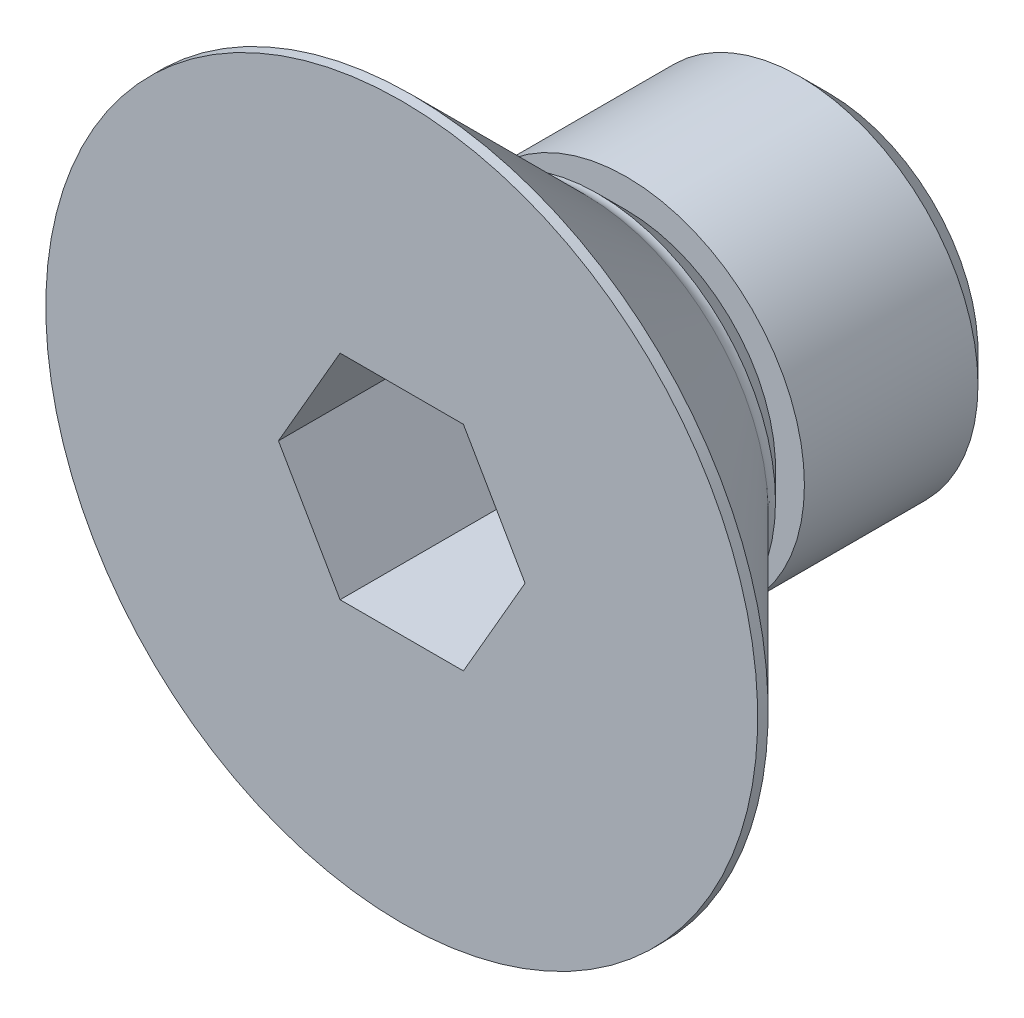
ISO-10303-21;
HEADER;
FILE_DESCRIPTION(('STEP AP214'),'2;1');
FILE_NAME('part.step','',(''),(''),'','','');
FILE_SCHEMA(('AUTOMOTIVE_DESIGN { 1 0 10303 214 1 1 1 1 }'));
ENDSEC;
DATA;
#1=APPLICATION_CONTEXT('core data for automotive mechanical design processes');
#2=APPLICATION_PROTOCOL_DEFINITION('international standard','automotive_design',2000,#1);
#3=PRODUCT_CONTEXT('',#1,'mechanical');
#4=PRODUCT('Part','Part','',(#3));
#5=PRODUCT_RELATED_PRODUCT_CATEGORY('part','',(#4));
#6=PRODUCT_DEFINITION_FORMATION('','',#4);
#7=PRODUCT_DEFINITION_CONTEXT('part definition',#1,'design');
#8=PRODUCT_DEFINITION('design','',#6,#7);
#9=PRODUCT_DEFINITION_SHAPE('','',#8);
#10=(LENGTH_UNIT() NAMED_UNIT(*) SI_UNIT(.MILLI.,.METRE.));
#11=(NAMED_UNIT(*) PLANE_ANGLE_UNIT() SI_UNIT($,.RADIAN.));
#12=(NAMED_UNIT(*) SI_UNIT($,.STERADIAN.) SOLID_ANGLE_UNIT());
#13=UNCERTAINTY_MEASURE_WITH_UNIT(LENGTH_MEASURE(1.E-05),#10,'distance_accuracy_value','');
#14=(GEOMETRIC_REPRESENTATION_CONTEXT(3) GLOBAL_UNCERTAINTY_ASSIGNED_CONTEXT((#13)) GLOBAL_UNIT_ASSIGNED_CONTEXT((#10,
#11,#12)) REPRESENTATION_CONTEXT('',''));
#15=CARTESIAN_POINT('',(0.,0.,0.));
#16=DIRECTION('',(0.,0.,1.));
#17=DIRECTION('',(1.,0.,0.));
#18=AXIS2_PLACEMENT_3D('',#15,#16,#17);
#19=CARTESIAN_POINT('',(0.,2.0940625,-12.));
#20=DIRECTION('',(0.,0.,-1.));
#21=DIRECTION('',(0.,1.,0.));
#22=AXIS2_PLACEMENT_3D('',#19,#20,#21);
#23=PLANE('',#22);
#24=CARTESIAN_POINT('',(0.,0.,-12.));
#25=DIRECTION('',(0.,0.,-1.));
#26=DIRECTION('',(0.,1.,0.));
#27=AXIS2_PLACEMENT_3D('',#24,#25,#26);
#28=CIRCLE('',#27,4.188125);
#29=CARTESIAN_POINT('',(0.,4.188125,-12.));
#30=VERTEX_POINT('',#29);
#31=EDGE_CURVE('E11',#30,#30,#28,.T.);
#32=ORIENTED_EDGE('',*,*,#31,.T.);
#33=EDGE_LOOP('',(#32));
#34=FACE_BOUND('',#33,.T.);
#35=ADVANCED_FACE('F17',(#34),#23,.T.);
#36=CARTESIAN_POINT('',(0.,0.,-11.5940625));
#37=DIRECTION('',(0.,0.,1.));
#38=DIRECTION('',(0.,1.,0.));
#39=AXIS2_PLACEMENT_3D('',#36,#37,#38);
#40=CONICAL_SURFACE('',#39,4.5940625,0.785398163397448);
#41=CARTESIAN_POINT('',(0.,0.,-11.188125));
#42=DIRECTION('',(0.,0.,-1.));
#43=DIRECTION('',(0.,1.,0.));
#44=AXIS2_PLACEMENT_3D('',#41,#42,#43);
#45=CIRCLE('',#44,5.);
#46=CARTESIAN_POINT('',(0.,5.,-11.188125));
#47=VERTEX_POINT('',#46);
#48=EDGE_CURVE('E29',#47,#47,#45,.T.);
#49=ORIENTED_EDGE('',*,*,#48,.T.);
#50=EDGE_LOOP('',(#49));
#51=FACE_BOUND('',#50,.T.);
#52=ORIENTED_EDGE('',*,*,#31,.F.);
#53=EDGE_LOOP('',(#52));
#54=FACE_BOUND('',#53,.T.);
#55=ADVANCED_FACE('F210',(#51,#54),#40,.T.);
#56=CARTESIAN_POINT('',(0.,0.,-8.5940625));
#57=DIRECTION('',(0.,0.,1.));
#58=DIRECTION('',(0.,1.,0.));
#59=AXIS2_PLACEMENT_3D('',#56,#57,#58);
#60=CYLINDRICAL_SURFACE('',#59,5.);
#61=ORIENTED_EDGE('',*,*,#48,.F.);
#62=EDGE_LOOP('',(#61));
#63=FACE_BOUND('',#62,.T.);
#64=CARTESIAN_POINT('',(0.,0.,-6.311875));
#65=DIRECTION('',(0.,0.,-1.));
#66=DIRECTION('',(0.,1.,0.));
#67=AXIS2_PLACEMENT_3D('',#64,#65,#66);
#68=CIRCLE('',#67,5.);
#69=CARTESIAN_POINT('',(0.,-5.,-6.311875));
#70=VERTEX_POINT('',#69);
#71=EDGE_CURVE('E131',#70,#70,#68,.T.);
#72=ORIENTED_EDGE('',*,*,#71,.T.);
#73=EDGE_LOOP('',(#72));
#74=FACE_BOUND('',#73,.T.);
#75=ADVANCED_FACE('F215',(#63,#74),#60,.T.);
#76=CARTESIAN_POINT('',(0.,0.,-5.5));
#77=DIRECTION('',(0.,0.,-1.));
#78=DIRECTION('',(-1.,0.,0.));
#79=AXIS2_PLACEMENT_3D('',#76,#77,#78);
#80=TOROIDAL_SURFACE('',#79,5.5,0.5);
#81=CARTESIAN_POINT('',(0.,0.,-5.14644660940673));
#82=DIRECTION('',(0.,0.,-1.));
#83=DIRECTION('',(0.,1.,0.));
#84=AXIS2_PLACEMENT_3D('',#81,#82,#83);
#85=CIRCLE('',#84,5.14644660940673);
#86=CARTESIAN_POINT('',(0.,5.14644660940673,-5.14644660940673));
#87=VERTEX_POINT('',#86);
#88=EDGE_CURVE('E157',#87,#87,#85,.T.);
#89=ORIENTED_EDGE('',*,*,#88,.T.);
#90=EDGE_LOOP('',(#89));
#91=FACE_BOUND('',#90,.T.);
#92=CARTESIAN_POINT('',(0.,0.,-5.5));
#93=DIRECTION('',(0.,0.,-1.));
#94=DIRECTION('',(0.,1.,0.));
#95=AXIS2_PLACEMENT_3D('',#92,#93,#94);
#96=CIRCLE('',#95,5.);
#97=CARTESIAN_POINT('',(0.,5.,-5.5));
#98=VERTEX_POINT('',#97);
#99=EDGE_CURVE('E154',#98,#98,#96,.T.);
#100=ORIENTED_EDGE('',*,*,#99,.F.);
#101=EDGE_LOOP('',(#100));
#102=FACE_BOUND('',#101,.T.);
#103=ADVANCED_FACE('F207',(#91,#102),#80,.F.);
#104=CARTESIAN_POINT('',(0.,0.,-2.71966991411009));
#105=DIRECTION('',(0.,0.,1.));
#106=DIRECTION('',(0.,1.,0.));
#107=AXIS2_PLACEMENT_3D('',#104,#105,#106);
#108=CONICAL_SURFACE('',#107,7.57322330470336,0.785398163397449);
#109=CARTESIAN_POINT('',(0.,0.,-0.292893218813454));
#110=DIRECTION('',(0.,0.,-1.));
#111=DIRECTION('',(0.,1.,0.));
#112=AXIS2_PLACEMENT_3D('',#109,#110,#111);
#113=CIRCLE('',#112,10.);
#114=CARTESIAN_POINT('',(0.,10.,-0.292893218813454));
#115=VERTEX_POINT('',#114);
#116=EDGE_CURVE('E149',#115,#115,#113,.T.);
#117=ORIENTED_EDGE('',*,*,#116,.T.);
#118=EDGE_LOOP('',(#117));
#119=FACE_BOUND('',#118,.T.);
#120=ORIENTED_EDGE('',*,*,#88,.F.);
#121=EDGE_LOOP('',(#120));
#122=FACE_BOUND('',#121,.T.);
#123=ADVANCED_FACE('F194',(#119,#122),#108,.T.);
#124=CARTESIAN_POINT('',(0.,0.,-0.146446609406727));
#125=DIRECTION('',(0.,0.,1.));
#126=DIRECTION('',(0.,1.,0.));
#127=AXIS2_PLACEMENT_3D('',#124,#125,#126);
#128=CYLINDRICAL_SURFACE('',#127,10.);
#129=CARTESIAN_POINT('',(0.,0.,0.));
#130=DIRECTION('',(0.,0.,-1.));
#131=DIRECTION('',(0.,1.,0.));
#132=AXIS2_PLACEMENT_3D('',#129,#130,#131);
#133=CIRCLE('',#132,10.);
#134=CARTESIAN_POINT('',(0.,10.,0.));
#135=VERTEX_POINT('',#134);
#136=EDGE_CURVE('E147',#135,#135,#133,.T.);
#137=ORIENTED_EDGE('',*,*,#136,.T.);
#138=EDGE_LOOP('',(#137));
#139=FACE_BOUND('',#138,.T.);
#140=ORIENTED_EDGE('',*,*,#116,.F.);
#141=EDGE_LOOP('',(#140));
#142=FACE_BOUND('',#141,.T.);
#143=ADVANCED_FACE('F19',(#139,#142),#128,.T.);
#144=CARTESIAN_POINT('',(0.,5.,0.));
#145=DIRECTION('',(0.,0.,1.));
#146=DIRECTION('',(0.,-1.,0.));
#147=AXIS2_PLACEMENT_3D('',#144,#145,#146);
#148=PLANE('',#147);
#149=ORIENTED_EDGE('',*,*,#136,.F.);
#150=EDGE_LOOP('',(#149));
#151=FACE_BOUND('',#150,.T.);
#152=DIRECTION('',(-0.5,0.866025403784439,0.));
#153=VECTOR('',#152,1.);
#154=CARTESIAN_POINT('',(-3.68060675473055,0.375000699375163,0.));
#155=LINE('',#154,#153);
#156=CARTESIAN_POINT('',(-1.73205,-2.99999860124967,0.));
#157=VERTEX_POINT('',#156);
#158=CARTESIAN_POINT('',(-3.4641,0.,0.));
#159=VERTEX_POINT('',#158);
#160=EDGE_CURVE('E146',#157,#159,#155,.T.);
#161=ORIENTED_EDGE('',*,*,#160,.T.);
#162=DIRECTION('',(0.5,0.866025403784439,0.));
#163=VECTOR('',#162,1.);
#164=CARTESIAN_POINT('',(-1.51554324526946,3.37499930062484,0.));
#165=LINE('',#164,#163);
#166=CARTESIAN_POINT('',(-1.73205,2.99999860124967,0.));
#167=VERTEX_POINT('',#166);
#168=EDGE_CURVE('E79',#159,#167,#165,.T.);
#169=ORIENTED_EDGE('',*,*,#168,.T.);
#170=DIRECTION('',(1.,0.,0.));
#171=VECTOR('',#170,1.);
#172=CARTESIAN_POINT('',(0.,2.99999860124967,0.));
#173=LINE('',#172,#171);
#174=CARTESIAN_POINT('',(1.73205,2.99999860124967,0.));
#175=VERTEX_POINT('',#174);
#176=EDGE_CURVE('E107',#167,#175,#173,.T.);
#177=ORIENTED_EDGE('',*,*,#176,.T.);
#178=DIRECTION('',(0.5,-0.866025403784439,0.));
#179=VECTOR('',#178,1.);
#180=CARTESIAN_POINT('',(1.51554324526945,3.37499930062484,0.));
#181=LINE('',#180,#179);
#182=CARTESIAN_POINT('',(3.4641,0.,0.));
#183=VERTEX_POINT('',#182);
#184=EDGE_CURVE('E150',#175,#183,#181,.T.);
#185=ORIENTED_EDGE('',*,*,#184,.T.);
#186=DIRECTION('',(-0.5,-0.866025403784439,0.));
#187=VECTOR('',#186,1.);
#188=CARTESIAN_POINT('',(3.68060675473055,0.375000699375163,0.));
#189=LINE('',#188,#187);
#190=CARTESIAN_POINT('',(1.73205,-2.99999860124967,0.));
#191=VERTEX_POINT('',#190);
#192=EDGE_CURVE('E141',#183,#191,#189,.T.);
#193=ORIENTED_EDGE('',*,*,#192,.T.);
#194=DIRECTION('',(-1.,0.,0.));
#195=VECTOR('',#194,1.);
#196=CARTESIAN_POINT('',(0.,-2.99999860124967,0.));
#197=LINE('',#196,#195);
#198=EDGE_CURVE('E171',#191,#157,#197,.T.);
#199=ORIENTED_EDGE('',*,*,#198,.T.);
#200=EDGE_LOOP('',(#161,#169,#177,#185,#193,#199));
#201=FACE_BOUND('',#200,.T.);
#202=ADVANCED_FACE('F198',(#151,#201),#148,.T.);
#203=CARTESIAN_POINT('',(-2.598075,1.49999930062484,1.));
#204=DIRECTION('',(-0.866025403784439,0.5,0.));
#205=DIRECTION('',(0.5,0.866025403784439,0.));
#206=AXIS2_PLACEMENT_3D('',#203,#204,#205);
#207=PLANE('',#206);
#208=ORIENTED_EDGE('',*,*,#168,.F.);
#209=DIRECTION('',(0.,0.,-1.));
#210=VECTOR('',#209,1.);
#211=CARTESIAN_POINT('',(-3.4641,0.,1.));
#212=LINE('',#211,#210);
#213=CARTESIAN_POINT('',(-3.4641,0.,-4.4));
#214=VERTEX_POINT('',#213);
#215=EDGE_CURVE('E111',#159,#214,#212,.T.);
#216=ORIENTED_EDGE('',*,*,#215,.T.);
#217=CARTESIAN_POINT('',(-3.4641,0.,-4.4));
#218=CARTESIAN_POINT('',(-2.598075,1.49999930062483,-4.89999976687495));
#219=CARTESIAN_POINT('',(-1.73205,2.99999860124967,-4.4));
#220=(BOUNDED_CURVE() B_SPLINE_CURVE(2,(#217,#218,#219),.UNSPECIFIED.,.F.,
.F.) B_SPLINE_CURVE_WITH_KNOTS((3,3),(0.,3.50530677988333),
.UNSPECIFIED.) CURVE() GEOMETRIC_REPRESENTATION_ITEM() RATIONAL_B_SPLINE_CURVE((1.,
1.15470053837925,1.)) REPRESENTATION_ITEM(''));
#221=CARTESIAN_POINT('',(-1.73205,2.99999860124967,-4.4));
#222=VERTEX_POINT('',#221);
#223=EDGE_CURVE('E109',#214,#222,#220,.T.);
#224=ORIENTED_EDGE('',*,*,#223,.T.);
#225=DIRECTION('',(0.,0.,-1.));
#226=VECTOR('',#225,1.);
#227=CARTESIAN_POINT('',(-1.73205,2.99999860124967,1.));
#228=LINE('',#227,#226);
#229=EDGE_CURVE('E100',#167,#222,#228,.T.);
#230=ORIENTED_EDGE('',*,*,#229,.F.);
#231=EDGE_LOOP('',(#208,#216,#224,#230));
#232=FACE_BOUND('',#231,.T.);
#233=ADVANCED_FACE('F110',(#232),#207,.F.);
#234=CARTESIAN_POINT('',(0.,2.99999860124967,1.));
#235=DIRECTION('',(0.,1.,0.));
#236=DIRECTION('',(1.,0.,0.));
#237=AXIS2_PLACEMENT_3D('',#234,#235,#236);
#238=PLANE('',#237);
#239=ORIENTED_EDGE('',*,*,#176,.F.);
#240=ORIENTED_EDGE('',*,*,#229,.T.);
#241=CARTESIAN_POINT('',(-1.73205,2.99999860124967,-4.4));
#242=CARTESIAN_POINT('',(0.,2.99999860124967,-4.89999976687495));
#243=CARTESIAN_POINT('',(1.73205,2.99999860124967,-4.4));
#244=(BOUNDED_CURVE() B_SPLINE_CURVE(2,(#241,#242,#243),.UNSPECIFIED.,.F.,
.F.) B_SPLINE_CURVE_WITH_KNOTS((3,3),(0.,3.50530677988333),
.UNSPECIFIED.) CURVE() GEOMETRIC_REPRESENTATION_ITEM() RATIONAL_B_SPLINE_CURVE((1.,
1.15470053837925,1.)) REPRESENTATION_ITEM(''));
#245=CARTESIAN_POINT('',(1.73205,2.99999860124967,-4.4));
#246=VERTEX_POINT('',#245);
#247=EDGE_CURVE('E105',#222,#246,#244,.T.);
#248=ORIENTED_EDGE('',*,*,#247,.T.);
#249=DIRECTION('',(0.,0.,-1.));
#250=VECTOR('',#249,1.);
#251=CARTESIAN_POINT('',(1.73205,2.99999860124967,1.));
#252=LINE('',#251,#250);
#253=EDGE_CURVE('E153',#175,#246,#252,.T.);
#254=ORIENTED_EDGE('',*,*,#253,.F.);
#255=EDGE_LOOP('',(#239,#240,#248,#254));
#256=FACE_BOUND('',#255,.T.);
#257=ADVANCED_FACE('F102',(#256),#238,.F.);
#258=CARTESIAN_POINT('',(-2.598075,-1.49999930062484,1.));
#259=DIRECTION('',(-0.866025403784439,-0.5,0.));
#260=DIRECTION('',(-0.5,0.866025403784439,0.));
#261=AXIS2_PLACEMENT_3D('',#258,#259,#260);
#262=PLANE('',#261);
#263=ORIENTED_EDGE('',*,*,#160,.F.);
#264=DIRECTION('',(0.,0.,-1.));
#265=VECTOR('',#264,1.);
#266=CARTESIAN_POINT('',(-1.73205,-2.99999860124967,1.));
#267=LINE('',#266,#265);
#268=CARTESIAN_POINT('',(-1.73205,-2.99999860124967,-4.4));
#269=VERTEX_POINT('',#268);
#270=EDGE_CURVE('E117',#157,#269,#267,.T.);
#271=ORIENTED_EDGE('',*,*,#270,.T.);
#272=CARTESIAN_POINT('',(-1.73205,-2.99999860124967,-4.4));
#273=CARTESIAN_POINT('',(-2.598075,-1.49999930062485,-4.89999976687495));
#274=CARTESIAN_POINT('',(-3.4641,0.,-4.4));
#275=(BOUNDED_CURVE() B_SPLINE_CURVE(2,(#272,#273,#274),.UNSPECIFIED.,.F.,
.F.) B_SPLINE_CURVE_WITH_KNOTS((3,3),(0.,3.50530677988333),
.UNSPECIFIED.) CURVE() GEOMETRIC_REPRESENTATION_ITEM() RATIONAL_B_SPLINE_CURVE((1.,
1.15470053837924,1.)) REPRESENTATION_ITEM(''));
#276=EDGE_CURVE('E95',#269,#214,#275,.T.);
#277=ORIENTED_EDGE('',*,*,#276,.T.);
#278=ORIENTED_EDGE('',*,*,#215,.F.);
#279=EDGE_LOOP('',(#263,#271,#277,#278));
#280=FACE_BOUND('',#279,.T.);
#281=ADVANCED_FACE('F222',(#280),#262,.F.);
#282=CARTESIAN_POINT('',(0.,0.,-5.39999953374989));
#283=DIRECTION('',(0.,0.,1.));
#284=DIRECTION('',(0.,1.,0.));
#285=AXIS2_PLACEMENT_3D('',#282,#283,#284);
#286=CONICAL_SURFACE('',#285,1.73205,1.0471975511966);
#287=CARTESIAN_POINT('',(0.,0.,-6.39999906749978));
#288=VERTEX_POINT('',#287);
#289=VERTEX_LOOP('',#288);
#290=FACE_BOUND('',#289,.T.);
#291=CARTESIAN_POINT('',(1.73205,2.99999860124967,-4.4));
#292=CARTESIAN_POINT('',(2.59807500000001,1.49999930062485,-4.89999976687495));
#293=CARTESIAN_POINT('',(3.4641,0.,-4.4));
#294=(BOUNDED_CURVE() B_SPLINE_CURVE(2,(#291,#292,#293),.UNSPECIFIED.,.F.,
.F.) B_SPLINE_CURVE_WITH_KNOTS((3,3),(0.,3.50530677988333),
.UNSPECIFIED.) CURVE() GEOMETRIC_REPRESENTATION_ITEM() RATIONAL_B_SPLINE_CURVE((1.,
1.15470053837924,1.)) REPRESENTATION_ITEM(''));
#295=CARTESIAN_POINT('',(3.4641,0.,-4.4));
#296=VERTEX_POINT('',#295);
#297=EDGE_CURVE('E21',#246,#296,#294,.T.);
#298=ORIENTED_EDGE('',*,*,#297,.F.);
#299=ORIENTED_EDGE('',*,*,#247,.F.);
#300=ORIENTED_EDGE('',*,*,#223,.F.);
#301=ORIENTED_EDGE('',*,*,#276,.F.);
#302=CARTESIAN_POINT('',(1.73205,-2.99999860124967,-4.4));
#303=CARTESIAN_POINT('',(0.,-2.99999860124969,-4.89999976687495));
#304=CARTESIAN_POINT('',(-1.73205,-2.99999860124967,-4.4));
#305=(BOUNDED_CURVE() B_SPLINE_CURVE(2,(#302,#303,#304),.UNSPECIFIED.,.F.,
.F.) B_SPLINE_CURVE_WITH_KNOTS((3,3),(0.,3.50530677988333),
.UNSPECIFIED.) CURVE() GEOMETRIC_REPRESENTATION_ITEM() RATIONAL_B_SPLINE_CURVE((1.,
1.15470053837924,1.)) REPRESENTATION_ITEM(''));
#306=CARTESIAN_POINT('',(1.73205,-2.99999860124967,-4.4));
#307=VERTEX_POINT('',#306);
#308=EDGE_CURVE('E119',#307,#269,#305,.T.);
#309=ORIENTED_EDGE('',*,*,#308,.F.);
#310=CARTESIAN_POINT('',(3.4641,0.,-4.4));
#311=CARTESIAN_POINT('',(2.598075,-1.49999930062484,-4.89999976687495));
#312=CARTESIAN_POINT('',(1.73205,-2.99999860124967,-4.4));
#313=(BOUNDED_CURVE() B_SPLINE_CURVE(2,(#310,#311,#312),.UNSPECIFIED.,.F.,
.F.) B_SPLINE_CURVE_WITH_KNOTS((3,3),(0.,3.50530677988332),
.UNSPECIFIED.) CURVE() GEOMETRIC_REPRESENTATION_ITEM() RATIONAL_B_SPLINE_CURVE((1.,
1.15470053837925,1.)) REPRESENTATION_ITEM(''));
#314=EDGE_CURVE('E135',#296,#307,#313,.T.);
#315=ORIENTED_EDGE('',*,*,#314,.F.);
#316=EDGE_LOOP('',(#298,#299,#300,#301,#309,#315));
#317=FACE_BOUND('',#316,.T.);
#318=ADVANCED_FACE('F113',(#290,#317),#286,.F.);
#319=CARTESIAN_POINT('',(0.,-2.99999860124967,1.));
#320=DIRECTION('',(0.,-1.,0.));
#321=DIRECTION('',(-1.,0.,0.));
#322=AXIS2_PLACEMENT_3D('',#319,#320,#321);
#323=PLANE('',#322);
#324=ORIENTED_EDGE('',*,*,#198,.F.);
#325=DIRECTION('',(0.,0.,-1.));
#326=VECTOR('',#325,1.);
#327=CARTESIAN_POINT('',(1.73205,-2.99999860124967,1.));
#328=LINE('',#327,#326);
#329=EDGE_CURVE('E140',#191,#307,#328,.T.);
#330=ORIENTED_EDGE('',*,*,#329,.T.);
#331=ORIENTED_EDGE('',*,*,#308,.T.);
#332=ORIENTED_EDGE('',*,*,#270,.F.);
#333=EDGE_LOOP('',(#324,#330,#331,#332));
#334=FACE_BOUND('',#333,.T.);
#335=ADVANCED_FACE('F220',(#334),#323,.F.);
#336=CARTESIAN_POINT('',(2.598075,-1.49999930062484,1.));
#337=DIRECTION('',(0.866025403784439,-0.5,0.));
#338=DIRECTION('',(-0.5,-0.866025403784439,0.));
#339=AXIS2_PLACEMENT_3D('',#336,#337,#338);
#340=PLANE('',#339);
#341=ORIENTED_EDGE('',*,*,#192,.F.);
#342=DIRECTION('',(0.,0.,-1.));
#343=VECTOR('',#342,1.);
#344=CARTESIAN_POINT('',(3.4641,0.,1.));
#345=LINE('',#344,#343);
#346=EDGE_CURVE('E159',#183,#296,#345,.T.);
#347=ORIENTED_EDGE('',*,*,#346,.T.);
#348=ORIENTED_EDGE('',*,*,#314,.T.);
#349=ORIENTED_EDGE('',*,*,#329,.F.);
#350=EDGE_LOOP('',(#341,#347,#348,#349));
#351=FACE_BOUND('',#350,.T.);
#352=ADVANCED_FACE('F190',(#351),#340,.F.);
#353=CARTESIAN_POINT('',(2.598075,1.49999930062484,1.));
#354=DIRECTION('',(0.866025403784439,0.5,0.));
#355=DIRECTION('',(0.5,-0.866025403784439,0.));
#356=AXIS2_PLACEMENT_3D('',#353,#354,#355);
#357=PLANE('',#356);
#358=ORIENTED_EDGE('',*,*,#184,.F.);
#359=ORIENTED_EDGE('',*,*,#253,.T.);
#360=ORIENTED_EDGE('',*,*,#297,.T.);
#361=ORIENTED_EDGE('',*,*,#346,.F.);
#362=EDGE_LOOP('',(#358,#359,#360,#361));
#363=FACE_BOUND('',#362,.T.);
#364=ADVANCED_FACE('F186',(#363),#357,.F.);
#365=CARTESIAN_POINT('',(0.,0.,-5.9059375));
#366=DIRECTION('',(0.,0.,1.));
#367=DIRECTION('',(0.,1.,0.));
#368=AXIS2_PLACEMENT_3D('',#365,#366,#367);
#369=CONICAL_SURFACE('',#368,4.5940625,0.785398163397448);
#370=CARTESIAN_POINT('',(0.,0.,-6.311875));
#371=DIRECTION('',(0.,0.,-1.));
#372=DIRECTION('',(0.,1.,0.));
#373=AXIS2_PLACEMENT_3D('',#370,#371,#372);
#374=CIRCLE('',#373,4.188125);
#375=CARTESIAN_POINT('',(0.,4.188125,-6.311875));
#376=VERTEX_POINT('',#375);
#377=EDGE_CURVE('E134',#376,#376,#374,.T.);
#378=ORIENTED_EDGE('',*,*,#377,.F.);
#379=EDGE_LOOP('',(#378));
#380=FACE_BOUND('',#379,.T.);
#381=ORIENTED_EDGE('',*,*,#99,.T.);
#382=EDGE_LOOP('',(#381));
#383=FACE_BOUND('',#382,.T.);
#384=ADVANCED_FACE('F232',(#380,#383),#369,.T.);
#385=CARTESIAN_POINT('',(0.,5.0940625,-6.311875));
#386=DIRECTION('',(0.,0.,-1.));
#387=DIRECTION('',(0.,1.,0.));
#388=AXIS2_PLACEMENT_3D('',#385,#386,#387);
#389=PLANE('',#388);
#390=ORIENTED_EDGE('',*,*,#377,.T.);
#391=EDGE_LOOP('',(#390));
#392=FACE_BOUND('',#391,.T.);
#393=ORIENTED_EDGE('',*,*,#71,.F.);
#394=EDGE_LOOP('',(#393));
#395=FACE_BOUND('',#394,.T.);
#396=ADVANCED_FACE('F229',(#392,#395),#389,.F.);
#397=CLOSED_SHELL('',(#35,#55,#75,#103,#123,#143,#202,#233,#257,#281,#318,#335,#352,#364,#384,#396));
#398=MANIFOLD_SOLID_BREP('B1',#397);
#399=ADVANCED_BREP_SHAPE_REPRESENTATION('',(#18,#398),#14);
#400=SHAPE_DEFINITION_REPRESENTATION(#9,#399);
ENDSEC;
END-ISO-10303-21;
